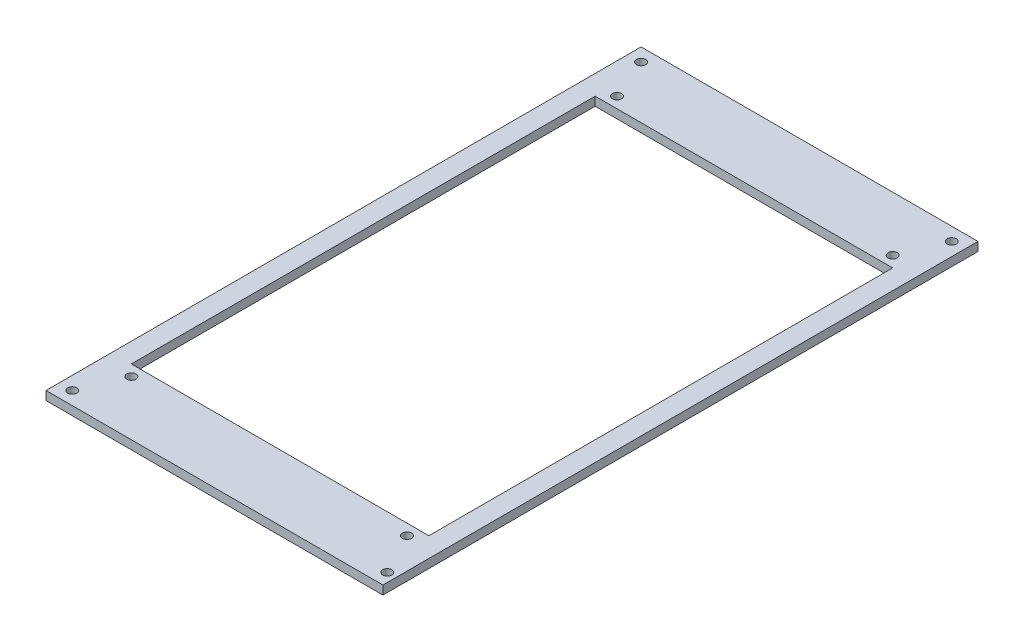
ISO-10303-21;
HEADER;
FILE_DESCRIPTION(('STEP AP214'),'2;1');
FILE_NAME('part.step','',(''),(''),'','','');
FILE_SCHEMA(('AUTOMOTIVE_DESIGN { 1 0 10303 214 1 1 1 1 }'));
ENDSEC;
DATA;
#1=APPLICATION_CONTEXT('core data for automotive mechanical design processes');
#2=APPLICATION_PROTOCOL_DEFINITION('international standard','automotive_design',2000,#1);
#3=PRODUCT_CONTEXT('',#1,'mechanical');
#4=PRODUCT('Part','Part','',(#3));
#5=PRODUCT_RELATED_PRODUCT_CATEGORY('part','',(#4));
#6=PRODUCT_DEFINITION_FORMATION('','',#4);
#7=PRODUCT_DEFINITION_CONTEXT('part definition',#1,'design');
#8=PRODUCT_DEFINITION('design','',#6,#7);
#9=PRODUCT_DEFINITION_SHAPE('','',#8);
#10=(LENGTH_UNIT() NAMED_UNIT(*) SI_UNIT(.MILLI.,.METRE.));
#11=(NAMED_UNIT(*) PLANE_ANGLE_UNIT() SI_UNIT($,.RADIAN.));
#12=(NAMED_UNIT(*) SI_UNIT($,.STERADIAN.) SOLID_ANGLE_UNIT());
#13=UNCERTAINTY_MEASURE_WITH_UNIT(LENGTH_MEASURE(1.E-05),#10,'distance_accuracy_value','');
#14=(GEOMETRIC_REPRESENTATION_CONTEXT(3) GLOBAL_UNCERTAINTY_ASSIGNED_CONTEXT((#13)) GLOBAL_UNIT_ASSIGNED_CONTEXT((#10,
#11,#12)) REPRESENTATION_CONTEXT('',''));
#15=CARTESIAN_POINT('',(0.,0.,0.));
#16=DIRECTION('',(0.,0.,1.));
#17=DIRECTION('',(1.,0.,0.));
#18=AXIS2_PLACEMENT_3D('',#15,#16,#17);
#19=CARTESIAN_POINT('',(0.,2.,15.));
#20=DIRECTION('',(0.,0.,-1.));
#21=DIRECTION('',(-1.,0.,0.));
#22=AXIS2_PLACEMENT_3D('',#19,#20,#21);
#23=PLANE('',#22);
#24=DIRECTION('',(1.,0.,0.));
#25=VECTOR('',#24,1.);
#26=CARTESIAN_POINT('',(0.,0.,15.));
#27=LINE('',#26,#25);
#28=CARTESIAN_POINT('',(4.50000000000001,0.,15.));
#29=VERTEX_POINT('',#28);
#30=CARTESIAN_POINT('',(72.5,0.,15.));
#31=VERTEX_POINT('',#30);
#32=EDGE_CURVE('E190',#29,#31,#27,.T.);
#33=ORIENTED_EDGE('',*,*,#32,.T.);
#34=DIRECTION('',(0.,-1.,0.));
#35=VECTOR('',#34,1.);
#36=CARTESIAN_POINT('',(72.5,2.,15.));
#37=LINE('',#36,#35);
#38=CARTESIAN_POINT('',(72.5,2.,15.));
#39=VERTEX_POINT('',#38);
#40=EDGE_CURVE('E11',#39,#31,#37,.T.);
#41=ORIENTED_EDGE('',*,*,#40,.F.);
#42=DIRECTION('',(1.,0.,0.));
#43=VECTOR('',#42,1.);
#44=CARTESIAN_POINT('',(0.,2.,15.));
#45=LINE('',#44,#43);
#46=CARTESIAN_POINT('',(4.50000000000001,2.,15.));
#47=VERTEX_POINT('',#46);
#48=EDGE_CURVE('E121',#47,#39,#45,.T.);
#49=ORIENTED_EDGE('',*,*,#48,.F.);
#50=DIRECTION('',(0.,-1.,0.));
#51=VECTOR('',#50,1.);
#52=CARTESIAN_POINT('',(4.50000000000001,2.,15.));
#53=LINE('',#52,#51);
#54=EDGE_CURVE('E61',#47,#29,#53,.T.);
#55=ORIENTED_EDGE('',*,*,#54,.T.);
#56=EDGE_LOOP('',(#33,#41,#49,#55));
#57=FACE_BOUND('',#56,.T.);
#58=ADVANCED_FACE('F41',(#57),#23,.F.);
#59=CARTESIAN_POINT('',(72.5,2.,0.));
#60=DIRECTION('',(1.,0.,0.));
#61=DIRECTION('',(0.,0.,-1.));
#62=AXIS2_PLACEMENT_3D('',#59,#60,#61);
#63=PLANE('',#62);
#64=DIRECTION('',(0.,0.,1.));
#65=VECTOR('',#64,1.);
#66=CARTESIAN_POINT('',(72.5,0.,0.));
#67=LINE('',#66,#65);
#68=CARTESIAN_POINT('',(72.5,0.,121.));
#69=VERTEX_POINT('',#68);
#70=EDGE_CURVE('E128',#31,#69,#67,.T.);
#71=ORIENTED_EDGE('',*,*,#70,.T.);
#72=DIRECTION('',(0.,-1.,0.));
#73=VECTOR('',#72,1.);
#74=CARTESIAN_POINT('',(72.5,2.,121.));
#75=LINE('',#74,#73);
#76=CARTESIAN_POINT('',(72.5,2.,121.));
#77=VERTEX_POINT('',#76);
#78=EDGE_CURVE('E52',#77,#69,#75,.T.);
#79=ORIENTED_EDGE('',*,*,#78,.F.);
#80=DIRECTION('',(0.,0.,1.));
#81=VECTOR('',#80,1.);
#82=CARTESIAN_POINT('',(72.5,2.,0.));
#83=LINE('',#82,#81);
#84=EDGE_CURVE('E115',#39,#77,#83,.T.);
#85=ORIENTED_EDGE('',*,*,#84,.F.);
#86=ORIENTED_EDGE('',*,*,#40,.T.);
#87=EDGE_LOOP('',(#71,#79,#85,#86));
#88=FACE_BOUND('',#87,.T.);
#89=ADVANCED_FACE('F127',(#88),#63,.F.);
#90=CARTESIAN_POINT('',(0.,2.,121.));
#91=DIRECTION('',(0.,0.,-1.));
#92=DIRECTION('',(-1.,0.,0.));
#93=AXIS2_PLACEMENT_3D('',#90,#91,#92);
#94=PLANE('',#93);
#95=DIRECTION('',(1.,0.,0.));
#96=VECTOR('',#95,1.);
#97=CARTESIAN_POINT('',(0.,0.,121.));
#98=LINE('',#97,#96);
#99=CARTESIAN_POINT('',(4.50000000000002,0.,121.));
#100=VERTEX_POINT('',#99);
#101=EDGE_CURVE('E195',#100,#69,#98,.T.);
#102=ORIENTED_EDGE('',*,*,#101,.F.);
#103=DIRECTION('',(0.,-1.,0.));
#104=VECTOR('',#103,1.);
#105=CARTESIAN_POINT('',(4.50000000000002,2.,121.));
#106=LINE('',#105,#104);
#107=CARTESIAN_POINT('',(4.50000000000002,2.,121.));
#108=VERTEX_POINT('',#107);
#109=EDGE_CURVE('E87',#108,#100,#106,.T.);
#110=ORIENTED_EDGE('',*,*,#109,.F.);
#111=DIRECTION('',(1.,0.,0.));
#112=VECTOR('',#111,1.);
#113=CARTESIAN_POINT('',(0.,2.,121.));
#114=LINE('',#113,#112);
#115=EDGE_CURVE('E120',#108,#77,#114,.T.);
#116=ORIENTED_EDGE('',*,*,#115,.T.);
#117=ORIENTED_EDGE('',*,*,#78,.T.);
#118=EDGE_LOOP('',(#102,#110,#116,#117));
#119=FACE_BOUND('',#118,.T.);
#120=ADVANCED_FACE('F133',(#119),#94,.T.);
#121=CARTESIAN_POINT('',(77.,2.,0.));
#122=DIRECTION('',(1.,0.,0.));
#123=DIRECTION('',(0.,0.,-1.));
#124=AXIS2_PLACEMENT_3D('',#121,#122,#123);
#125=PLANE('',#124);
#126=DIRECTION('',(0.,0.,1.));
#127=VECTOR('',#126,1.);
#128=CARTESIAN_POINT('',(77.,0.,0.));
#129=LINE('',#128,#127);
#130=CARTESIAN_POINT('',(77.,0.,0.));
#131=VERTEX_POINT('',#130);
#132=CARTESIAN_POINT('',(77.,0.,136.));
#133=VERTEX_POINT('',#132);
#134=EDGE_CURVE('E174',#131,#133,#129,.T.);
#135=ORIENTED_EDGE('',*,*,#134,.F.);
#136=DIRECTION('',(0.,-1.,0.));
#137=VECTOR('',#136,1.);
#138=CARTESIAN_POINT('',(77.,2.,0.));
#139=LINE('',#138,#137);
#140=CARTESIAN_POINT('',(77.,2.,0.));
#141=VERTEX_POINT('',#140);
#142=EDGE_CURVE('E45',#141,#131,#139,.T.);
#143=ORIENTED_EDGE('',*,*,#142,.F.);
#144=DIRECTION('',(0.,0.,1.));
#145=VECTOR('',#144,1.);
#146=CARTESIAN_POINT('',(77.,2.,0.));
#147=LINE('',#146,#145);
#148=CARTESIAN_POINT('',(77.,2.,136.));
#149=VERTEX_POINT('',#148);
#150=EDGE_CURVE('E242',#141,#149,#147,.T.);
#151=ORIENTED_EDGE('',*,*,#150,.T.);
#152=DIRECTION('',(0.,-1.,0.));
#153=VECTOR('',#152,1.);
#154=CARTESIAN_POINT('',(77.,2.,136.));
#155=LINE('',#154,#153);
#156=EDGE_CURVE('E138',#149,#133,#155,.T.);
#157=ORIENTED_EDGE('',*,*,#156,.T.);
#158=EDGE_LOOP('',(#135,#143,#151,#157));
#159=FACE_BOUND('',#158,.T.);
#160=ADVANCED_FACE('F224',(#159),#125,.T.);
#161=CARTESIAN_POINT('',(0.,2.,0.));
#162=DIRECTION('',(0.,0.,-1.));
#163=DIRECTION('',(-1.,0.,0.));
#164=AXIS2_PLACEMENT_3D('',#161,#162,#163);
#165=PLANE('',#164);
#166=DIRECTION('',(1.,0.,0.));
#167=VECTOR('',#166,1.);
#168=CARTESIAN_POINT('',(0.,0.,0.));
#169=LINE('',#168,#167);
#170=CARTESIAN_POINT('',(0.,0.,0.));
#171=VERTEX_POINT('',#170);
#172=EDGE_CURVE('E178',#171,#131,#169,.T.);
#173=ORIENTED_EDGE('',*,*,#172,.F.);
#174=DIRECTION('',(0.,-1.,0.));
#175=VECTOR('',#174,1.);
#176=CARTESIAN_POINT('',(0.,2.,0.));
#177=LINE('',#176,#175);
#178=CARTESIAN_POINT('',(0.,2.,0.));
#179=VERTEX_POINT('',#178);
#180=EDGE_CURVE('E212',#179,#171,#177,.T.);
#181=ORIENTED_EDGE('',*,*,#180,.F.);
#182=DIRECTION('',(1.,0.,0.));
#183=VECTOR('',#182,1.);
#184=CARTESIAN_POINT('',(0.,2.,0.));
#185=LINE('',#184,#183);
#186=EDGE_CURVE('E223',#179,#141,#185,.T.);
#187=ORIENTED_EDGE('',*,*,#186,.T.);
#188=ORIENTED_EDGE('',*,*,#142,.T.);
#189=EDGE_LOOP('',(#173,#181,#187,#188));
#190=FACE_BOUND('',#189,.T.);
#191=ADVANCED_FACE('F221',(#190),#165,.T.);
#192=CARTESIAN_POINT('',(0.,2.,0.));
#193=DIRECTION('',(1.,0.,0.));
#194=DIRECTION('',(0.,0.,-1.));
#195=AXIS2_PLACEMENT_3D('',#192,#193,#194);
#196=PLANE('',#195);
#197=DIRECTION('',(0.,0.,1.));
#198=VECTOR('',#197,1.);
#199=CARTESIAN_POINT('',(0.,0.,0.));
#200=LINE('',#199,#198);
#201=CARTESIAN_POINT('',(0.,0.,136.));
#202=VERTEX_POINT('',#201);
#203=EDGE_CURVE('E182',#171,#202,#200,.T.);
#204=ORIENTED_EDGE('',*,*,#203,.T.);
#205=DIRECTION('',(0.,-1.,0.));
#206=VECTOR('',#205,1.);
#207=CARTESIAN_POINT('',(0.,2.,136.));
#208=LINE('',#207,#206);
#209=CARTESIAN_POINT('',(0.,2.,136.));
#210=VERTEX_POINT('',#209);
#211=EDGE_CURVE('E209',#210,#202,#208,.T.);
#212=ORIENTED_EDGE('',*,*,#211,.F.);
#213=DIRECTION('',(0.,0.,1.));
#214=VECTOR('',#213,1.);
#215=CARTESIAN_POINT('',(0.,2.,0.));
#216=LINE('',#215,#214);
#217=EDGE_CURVE('E232',#179,#210,#216,.T.);
#218=ORIENTED_EDGE('',*,*,#217,.F.);
#219=ORIENTED_EDGE('',*,*,#180,.T.);
#220=EDGE_LOOP('',(#204,#212,#218,#219));
#221=FACE_BOUND('',#220,.T.);
#222=ADVANCED_FACE('F230',(#221),#196,.F.);
#223=CARTESIAN_POINT('',(0.,2.,136.));
#224=DIRECTION('',(0.,0.,-1.));
#225=DIRECTION('',(-1.,0.,0.));
#226=AXIS2_PLACEMENT_3D('',#223,#224,#225);
#227=PLANE('',#226);
#228=DIRECTION('',(1.,0.,0.));
#229=VECTOR('',#228,1.);
#230=CARTESIAN_POINT('',(0.,0.,136.));
#231=LINE('',#230,#229);
#232=EDGE_CURVE('E186',#202,#133,#231,.T.);
#233=ORIENTED_EDGE('',*,*,#232,.T.);
#234=ORIENTED_EDGE('',*,*,#156,.F.);
#235=DIRECTION('',(1.,0.,0.));
#236=VECTOR('',#235,1.);
#237=CARTESIAN_POINT('',(0.,2.,136.));
#238=LINE('',#237,#236);
#239=EDGE_CURVE('E235',#210,#149,#238,.T.);
#240=ORIENTED_EDGE('',*,*,#239,.F.);
#241=ORIENTED_EDGE('',*,*,#211,.T.);
#242=EDGE_LOOP('',(#233,#234,#240,#241));
#243=FACE_BOUND('',#242,.T.);
#244=ADVANCED_FACE('F234',(#243),#227,.F.);
#245=CARTESIAN_POINT('',(3.,2.,3.));
#246=DIRECTION('',(0.,-1.,0.));
#247=DIRECTION('',(0.,0.,-1.));
#248=AXIS2_PLACEMENT_3D('',#245,#246,#247);
#249=CYLINDRICAL_SURFACE('',#248,1.05);
#250=CARTESIAN_POINT('',(3.,2.,3.));
#251=DIRECTION('',(0.,1.,0.));
#252=DIRECTION('',(0.,0.,1.));
#253=AXIS2_PLACEMENT_3D('',#250,#251,#252);
#254=CIRCLE('',#253,1.05);
#255=CARTESIAN_POINT('',(3.,2.,4.05));
#256=VERTEX_POINT('',#255);
#257=EDGE_CURVE('E248',#256,#256,#254,.T.);
#258=ORIENTED_EDGE('',*,*,#257,.T.);
#259=EDGE_LOOP('',(#258));
#260=FACE_BOUND('',#259,.T.);
#261=CARTESIAN_POINT('',(3.,0.,3.));
#262=DIRECTION('',(0.,1.,0.));
#263=DIRECTION('',(0.,0.,1.));
#264=AXIS2_PLACEMENT_3D('',#261,#262,#263);
#265=CIRCLE('',#264,1.05);
#266=CARTESIAN_POINT('',(3.,0.,4.05));
#267=VERTEX_POINT('',#266);
#268=EDGE_CURVE('E170',#267,#267,#265,.T.);
#269=ORIENTED_EDGE('',*,*,#268,.F.);
#270=EDGE_LOOP('',(#269));
#271=FACE_BOUND('',#270,.T.);
#272=ADVANCED_FACE('F300',(#260,#271),#249,.F.);
#273=CARTESIAN_POINT('',(74.,2.,3.));
#274=DIRECTION('',(0.,-1.,0.));
#275=DIRECTION('',(0.,0.,-1.));
#276=AXIS2_PLACEMENT_3D('',#273,#274,#275);
#277=CYLINDRICAL_SURFACE('',#276,1.04999999999999);
#278=CARTESIAN_POINT('',(74.,2.,3.));
#279=DIRECTION('',(0.,1.,0.));
#280=DIRECTION('',(0.,0.,1.));
#281=AXIS2_PLACEMENT_3D('',#278,#279,#280);
#282=CIRCLE('',#281,1.04999999999999);
#283=CARTESIAN_POINT('',(74.,2.,4.04999999999999));
#284=VERTEX_POINT('',#283);
#285=EDGE_CURVE('E252',#284,#284,#282,.T.);
#286=ORIENTED_EDGE('',*,*,#285,.T.);
#287=EDGE_LOOP('',(#286));
#288=FACE_BOUND('',#287,.T.);
#289=CARTESIAN_POINT('',(74.,0.,3.));
#290=DIRECTION('',(0.,1.,0.));
#291=DIRECTION('',(0.,0.,1.));
#292=AXIS2_PLACEMENT_3D('',#289,#290,#291);
#293=CIRCLE('',#292,1.04999999999999);
#294=CARTESIAN_POINT('',(74.,0.,4.04999999999999));
#295=VERTEX_POINT('',#294);
#296=EDGE_CURVE('E166',#295,#295,#293,.T.);
#297=ORIENTED_EDGE('',*,*,#296,.F.);
#298=EDGE_LOOP('',(#297));
#299=FACE_BOUND('',#298,.T.);
#300=ADVANCED_FACE('F303',(#288,#299),#277,.F.);
#301=CARTESIAN_POINT('',(3.00000000000002,2.,133.));
#302=DIRECTION('',(0.,-1.,0.));
#303=DIRECTION('',(0.,0.,-1.));
#304=AXIS2_PLACEMENT_3D('',#301,#302,#303);
#305=CYLINDRICAL_SURFACE('',#304,1.05);
#306=CARTESIAN_POINT('',(3.00000000000002,2.,133.));
#307=DIRECTION('',(0.,1.,0.));
#308=DIRECTION('',(0.,0.,1.));
#309=AXIS2_PLACEMENT_3D('',#306,#307,#308);
#310=CIRCLE('',#309,1.05);
#311=CARTESIAN_POINT('',(3.00000000000002,2.,134.05));
#312=VERTEX_POINT('',#311);
#313=EDGE_CURVE('E256',#312,#312,#310,.T.);
#314=ORIENTED_EDGE('',*,*,#313,.T.);
#315=EDGE_LOOP('',(#314));
#316=FACE_BOUND('',#315,.T.);
#317=CARTESIAN_POINT('',(3.00000000000002,0.,133.));
#318=DIRECTION('',(0.,1.,0.));
#319=DIRECTION('',(0.,0.,1.));
#320=AXIS2_PLACEMENT_3D('',#317,#318,#319);
#321=CIRCLE('',#320,1.05);
#322=CARTESIAN_POINT('',(3.00000000000002,0.,134.05));
#323=VERTEX_POINT('',#322);
#324=EDGE_CURVE('E162',#323,#323,#321,.T.);
#325=ORIENTED_EDGE('',*,*,#324,.F.);
#326=EDGE_LOOP('',(#325));
#327=FACE_BOUND('',#326,.T.);
#328=ADVANCED_FACE('F332',(#316,#327),#305,.F.);
#329=CARTESIAN_POINT('',(75.,2.,133.));
#330=DIRECTION('',(0.,-1.,0.));
#331=DIRECTION('',(0.,0.,-1.));
#332=AXIS2_PLACEMENT_3D('',#329,#330,#331);
#333=CYLINDRICAL_SURFACE('',#332,1.04999999999999);
#334=CARTESIAN_POINT('',(75.,2.,133.));
#335=DIRECTION('',(0.,1.,0.));
#336=DIRECTION('',(0.,0.,1.));
#337=AXIS2_PLACEMENT_3D('',#334,#335,#336);
#338=CIRCLE('',#337,1.04999999999999);
#339=CARTESIAN_POINT('',(75.,2.,134.05));
#340=VERTEX_POINT('',#339);
#341=EDGE_CURVE('E260',#340,#340,#338,.T.);
#342=ORIENTED_EDGE('',*,*,#341,.T.);
#343=EDGE_LOOP('',(#342));
#344=FACE_BOUND('',#343,.T.);
#345=CARTESIAN_POINT('',(75.,0.,133.));
#346=DIRECTION('',(0.,1.,0.));
#347=DIRECTION('',(0.,0.,1.));
#348=AXIS2_PLACEMENT_3D('',#345,#346,#347);
#349=CIRCLE('',#348,1.04999999999999);
#350=CARTESIAN_POINT('',(75.,0.,134.05));
#351=VERTEX_POINT('',#350);
#352=EDGE_CURVE('E158',#351,#351,#349,.T.);
#353=ORIENTED_EDGE('',*,*,#352,.F.);
#354=EDGE_LOOP('',(#353));
#355=FACE_BOUND('',#354,.T.);
#356=ADVANCED_FACE('F336',(#344,#355),#333,.F.);
#357=CARTESIAN_POINT('',(7.00000000000001,2.,12.5));
#358=DIRECTION('',(0.,-1.,0.));
#359=DIRECTION('',(0.,0.,-1.));
#360=AXIS2_PLACEMENT_3D('',#357,#358,#359);
#361=CYLINDRICAL_SURFACE('',#360,1.05);
#362=CARTESIAN_POINT('',(7.00000000000001,2.,12.5));
#363=DIRECTION('',(0.,1.,0.));
#364=DIRECTION('',(0.,0.,1.));
#365=AXIS2_PLACEMENT_3D('',#362,#363,#364);
#366=CIRCLE('',#365,1.05);
#367=CARTESIAN_POINT('',(7.00000000000001,2.,13.55));
#368=VERTEX_POINT('',#367);
#369=EDGE_CURVE('E264',#368,#368,#366,.T.);
#370=ORIENTED_EDGE('',*,*,#369,.T.);
#371=EDGE_LOOP('',(#370));
#372=FACE_BOUND('',#371,.T.);
#373=CARTESIAN_POINT('',(7.00000000000001,0.,12.5));
#374=DIRECTION('',(0.,1.,0.));
#375=DIRECTION('',(0.,0.,1.));
#376=AXIS2_PLACEMENT_3D('',#373,#374,#375);
#377=CIRCLE('',#376,1.05);
#378=CARTESIAN_POINT('',(7.00000000000001,0.,13.55));
#379=VERTEX_POINT('',#378);
#380=EDGE_CURVE('E154',#379,#379,#377,.T.);
#381=ORIENTED_EDGE('',*,*,#380,.F.);
#382=EDGE_LOOP('',(#381));
#383=FACE_BOUND('',#382,.T.);
#384=ADVANCED_FACE('F340',(#372,#383),#361,.F.);
#385=CARTESIAN_POINT('',(70.,2.,12.5));
#386=DIRECTION('',(0.,-1.,0.));
#387=DIRECTION('',(0.,0.,-1.));
#388=AXIS2_PLACEMENT_3D('',#385,#386,#387);
#389=CYLINDRICAL_SURFACE('',#388,1.04999999999999);
#390=CARTESIAN_POINT('',(70.,2.,12.5));
#391=DIRECTION('',(0.,1.,0.));
#392=DIRECTION('',(0.,0.,1.));
#393=AXIS2_PLACEMENT_3D('',#390,#391,#392);
#394=CIRCLE('',#393,1.04999999999999);
#395=CARTESIAN_POINT('',(70.,2.,13.55));
#396=VERTEX_POINT('',#395);
#397=EDGE_CURVE('E268',#396,#396,#394,.T.);
#398=ORIENTED_EDGE('',*,*,#397,.T.);
#399=EDGE_LOOP('',(#398));
#400=FACE_BOUND('',#399,.T.);
#401=CARTESIAN_POINT('',(70.,0.,12.5));
#402=DIRECTION('',(0.,1.,0.));
#403=DIRECTION('',(0.,0.,1.));
#404=AXIS2_PLACEMENT_3D('',#401,#402,#403);
#405=CIRCLE('',#404,1.04999999999999);
#406=CARTESIAN_POINT('',(70.,0.,13.55));
#407=VERTEX_POINT('',#406);
#408=EDGE_CURVE('E150',#407,#407,#405,.T.);
#409=ORIENTED_EDGE('',*,*,#408,.F.);
#410=EDGE_LOOP('',(#409));
#411=FACE_BOUND('',#410,.T.);
#412=ADVANCED_FACE('F344',(#400,#411),#389,.F.);
#413=CARTESIAN_POINT('',(70.,2.,123.5));
#414=DIRECTION('',(0.,-1.,0.));
#415=DIRECTION('',(0.,0.,-1.));
#416=AXIS2_PLACEMENT_3D('',#413,#414,#415);
#417=CYLINDRICAL_SURFACE('',#416,1.04999999999999);
#418=CARTESIAN_POINT('',(70.,2.,123.5));
#419=DIRECTION('',(0.,1.,0.));
#420=DIRECTION('',(0.,0.,1.));
#421=AXIS2_PLACEMENT_3D('',#418,#419,#420);
#422=CIRCLE('',#421,1.04999999999999);
#423=CARTESIAN_POINT('',(70.,2.,124.55));
#424=VERTEX_POINT('',#423);
#425=EDGE_CURVE('E272',#424,#424,#422,.T.);
#426=ORIENTED_EDGE('',*,*,#425,.T.);
#427=EDGE_LOOP('',(#426));
#428=FACE_BOUND('',#427,.T.);
#429=CARTESIAN_POINT('',(70.,0.,123.5));
#430=DIRECTION('',(0.,1.,0.));
#431=DIRECTION('',(0.,0.,1.));
#432=AXIS2_PLACEMENT_3D('',#429,#430,#431);
#433=CIRCLE('',#432,1.04999999999999);
#434=CARTESIAN_POINT('',(70.,0.,124.55));
#435=VERTEX_POINT('',#434);
#436=EDGE_CURVE('E146',#435,#435,#433,.T.);
#437=ORIENTED_EDGE('',*,*,#436,.F.);
#438=EDGE_LOOP('',(#437));
#439=FACE_BOUND('',#438,.T.);
#440=ADVANCED_FACE('F347',(#428,#439),#417,.F.);
#441=CARTESIAN_POINT('',(7.00000000000003,2.,123.5));
#442=DIRECTION('',(0.,-1.,0.));
#443=DIRECTION('',(0.,0.,-1.));
#444=AXIS2_PLACEMENT_3D('',#441,#442,#443);
#445=CYLINDRICAL_SURFACE('',#444,1.05);
#446=CARTESIAN_POINT('',(7.00000000000003,2.,123.5));
#447=DIRECTION('',(0.,1.,0.));
#448=DIRECTION('',(0.,0.,1.));
#449=AXIS2_PLACEMENT_3D('',#446,#447,#448);
#450=CIRCLE('',#449,1.05);
#451=CARTESIAN_POINT('',(7.00000000000003,2.,124.55));
#452=VERTEX_POINT('',#451);
#453=EDGE_CURVE('E202',#452,#452,#450,.T.);
#454=ORIENTED_EDGE('',*,*,#453,.T.);
#455=EDGE_LOOP('',(#454));
#456=FACE_BOUND('',#455,.T.);
#457=CARTESIAN_POINT('',(7.00000000000003,0.,123.5));
#458=DIRECTION('',(0.,1.,0.));
#459=DIRECTION('',(0.,0.,1.));
#460=AXIS2_PLACEMENT_3D('',#457,#458,#459);
#461=CIRCLE('',#460,1.05);
#462=CARTESIAN_POINT('',(7.00000000000003,0.,124.55));
#463=VERTEX_POINT('',#462);
#464=EDGE_CURVE('E142',#463,#463,#461,.T.);
#465=ORIENTED_EDGE('',*,*,#464,.F.);
#466=EDGE_LOOP('',(#465));
#467=FACE_BOUND('',#466,.T.);
#468=ADVANCED_FACE('F43',(#456,#467),#445,.F.);
#469=CARTESIAN_POINT('',(4.50000000000001,2.,0.));
#470=DIRECTION('',(1.,0.,0.));
#471=DIRECTION('',(0.,0.,-1.));
#472=AXIS2_PLACEMENT_3D('',#469,#470,#471);
#473=PLANE('',#472);
#474=DIRECTION('',(0.,0.,1.));
#475=VECTOR('',#474,1.);
#476=CARTESIAN_POINT('',(4.50000000000001,0.,0.));
#477=LINE('',#476,#475);
#478=EDGE_CURVE('E198',#29,#100,#477,.T.);
#479=ORIENTED_EDGE('',*,*,#478,.F.);
#480=ORIENTED_EDGE('',*,*,#54,.F.);
#481=DIRECTION('',(0.,0.,1.));
#482=VECTOR('',#481,1.);
#483=CARTESIAN_POINT('',(4.50000000000001,2.,0.));
#484=LINE('',#483,#482);
#485=EDGE_CURVE('E135',#47,#108,#484,.T.);
#486=ORIENTED_EDGE('',*,*,#485,.T.);
#487=ORIENTED_EDGE('',*,*,#109,.T.);
#488=EDGE_LOOP('',(#479,#480,#486,#487));
#489=FACE_BOUND('',#488,.T.);
#490=ADVANCED_FACE('F284',(#489),#473,.T.);
#491=CARTESIAN_POINT('',(0.,2.,0.));
#492=DIRECTION('',(0.,1.,0.));
#493=DIRECTION('',(0.,0.,1.));
#494=AXIS2_PLACEMENT_3D('',#491,#492,#493);
#495=PLANE('',#494);
#496=ORIENTED_EDGE('',*,*,#453,.F.);
#497=EDGE_LOOP('',(#496));
#498=FACE_BOUND('',#497,.T.);
#499=ORIENTED_EDGE('',*,*,#425,.F.);
#500=EDGE_LOOP('',(#499));
#501=FACE_BOUND('',#500,.T.);
#502=ORIENTED_EDGE('',*,*,#397,.F.);
#503=EDGE_LOOP('',(#502));
#504=FACE_BOUND('',#503,.T.);
#505=ORIENTED_EDGE('',*,*,#369,.F.);
#506=EDGE_LOOP('',(#505));
#507=FACE_BOUND('',#506,.T.);
#508=ORIENTED_EDGE('',*,*,#341,.F.);
#509=EDGE_LOOP('',(#508));
#510=FACE_BOUND('',#509,.T.);
#511=ORIENTED_EDGE('',*,*,#313,.F.);
#512=EDGE_LOOP('',(#511));
#513=FACE_BOUND('',#512,.T.);
#514=ORIENTED_EDGE('',*,*,#285,.F.);
#515=EDGE_LOOP('',(#514));
#516=FACE_BOUND('',#515,.T.);
#517=ORIENTED_EDGE('',*,*,#257,.F.);
#518=EDGE_LOOP('',(#517));
#519=FACE_BOUND('',#518,.T.);
#520=ORIENTED_EDGE('',*,*,#150,.F.);
#521=ORIENTED_EDGE('',*,*,#186,.F.);
#522=ORIENTED_EDGE('',*,*,#217,.T.);
#523=ORIENTED_EDGE('',*,*,#239,.T.);
#524=EDGE_LOOP('',(#520,#521,#522,#523));
#525=FACE_BOUND('',#524,.T.);
#526=ORIENTED_EDGE('',*,*,#48,.T.);
#527=ORIENTED_EDGE('',*,*,#84,.T.);
#528=ORIENTED_EDGE('',*,*,#115,.F.);
#529=ORIENTED_EDGE('',*,*,#485,.F.);
#530=EDGE_LOOP('',(#526,#527,#528,#529));
#531=FACE_BOUND('',#530,.T.);
#532=ADVANCED_FACE('F117',(#498,#501,#504,#507,#510,#513,#516,#519,#525,#531),#495,.T.);
#533=CARTESIAN_POINT('',(0.,0.,0.));
#534=DIRECTION('',(0.,1.,0.));
#535=DIRECTION('',(0.,0.,1.));
#536=AXIS2_PLACEMENT_3D('',#533,#534,#535);
#537=PLANE('',#536);
#538=ORIENTED_EDGE('',*,*,#464,.T.);
#539=EDGE_LOOP('',(#538));
#540=FACE_BOUND('',#539,.T.);
#541=ORIENTED_EDGE('',*,*,#436,.T.);
#542=EDGE_LOOP('',(#541));
#543=FACE_BOUND('',#542,.T.);
#544=ORIENTED_EDGE('',*,*,#408,.T.);
#545=EDGE_LOOP('',(#544));
#546=FACE_BOUND('',#545,.T.);
#547=ORIENTED_EDGE('',*,*,#380,.T.);
#548=EDGE_LOOP('',(#547));
#549=FACE_BOUND('',#548,.T.);
#550=ORIENTED_EDGE('',*,*,#352,.T.);
#551=EDGE_LOOP('',(#550));
#552=FACE_BOUND('',#551,.T.);
#553=ORIENTED_EDGE('',*,*,#324,.T.);
#554=EDGE_LOOP('',(#553));
#555=FACE_BOUND('',#554,.T.);
#556=ORIENTED_EDGE('',*,*,#296,.T.);
#557=EDGE_LOOP('',(#556));
#558=FACE_BOUND('',#557,.T.);
#559=ORIENTED_EDGE('',*,*,#268,.T.);
#560=EDGE_LOOP('',(#559));
#561=FACE_BOUND('',#560,.T.);
#562=ORIENTED_EDGE('',*,*,#134,.T.);
#563=ORIENTED_EDGE('',*,*,#232,.F.);
#564=ORIENTED_EDGE('',*,*,#203,.F.);
#565=ORIENTED_EDGE('',*,*,#172,.T.);
#566=EDGE_LOOP('',(#562,#563,#564,#565));
#567=FACE_BOUND('',#566,.T.);
#568=ORIENTED_EDGE('',*,*,#32,.F.);
#569=ORIENTED_EDGE('',*,*,#478,.T.);
#570=ORIENTED_EDGE('',*,*,#101,.T.);
#571=ORIENTED_EDGE('',*,*,#70,.F.);
#572=EDGE_LOOP('',(#568,#569,#570,#571));
#573=FACE_BOUND('',#572,.T.);
#574=ADVANCED_FACE('F227',(#540,#543,#546,#549,#552,#555,#558,#561,#567,#573),#537,.F.);
#575=CLOSED_SHELL('',(#58,#89,#120,#160,#191,#222,#244,#272,#300,#328,#356,#384,#412,#440,#468,
#490,#532,#574));
#576=MANIFOLD_SOLID_BREP('B2',#575);
#577=ADVANCED_BREP_SHAPE_REPRESENTATION('',(#18,#576),#14);
#578=SHAPE_DEFINITION_REPRESENTATION(#9,#577);
ENDSEC;
END-ISO-10303-21;
